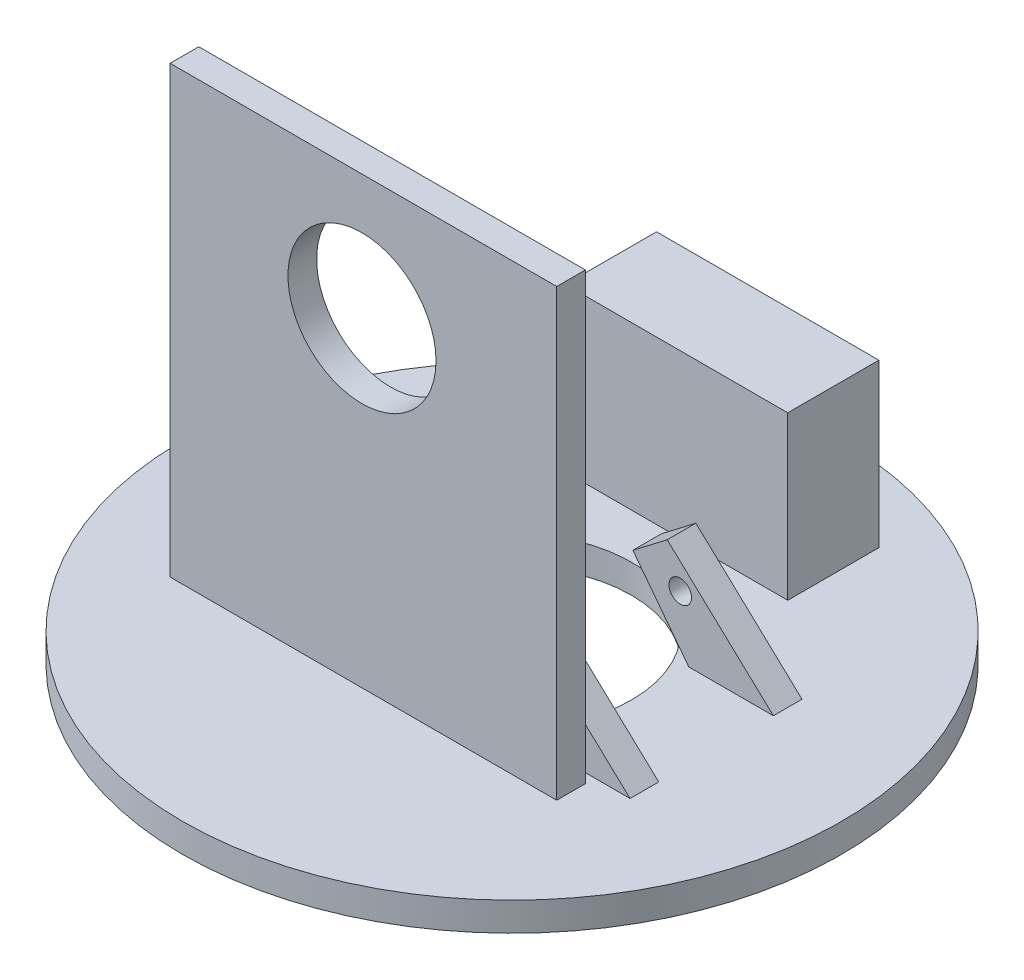
ISO-10303-21;
HEADER;
FILE_DESCRIPTION(('STEP AP214'),'2;1');
FILE_NAME('part.step','',(''),(''),'','','');
FILE_SCHEMA(('AUTOMOTIVE_DESIGN { 1 0 10303 214 1 1 1 1 }'));
ENDSEC;
DATA;
#1=APPLICATION_CONTEXT('core data for automotive mechanical design processes');
#2=APPLICATION_PROTOCOL_DEFINITION('international standard','automotive_design',2000,#1);
#3=PRODUCT_CONTEXT('',#1,'mechanical');
#4=PRODUCT('Part','Part','',(#3));
#5=PRODUCT_RELATED_PRODUCT_CATEGORY('part','',(#4));
#6=PRODUCT_DEFINITION_FORMATION('','',#4);
#7=PRODUCT_DEFINITION_CONTEXT('part definition',#1,'design');
#8=PRODUCT_DEFINITION('design','',#6,#7);
#9=PRODUCT_DEFINITION_SHAPE('','',#8);
#10=(LENGTH_UNIT() NAMED_UNIT(*) SI_UNIT(.MILLI.,.METRE.));
#11=(NAMED_UNIT(*) PLANE_ANGLE_UNIT() SI_UNIT($,.RADIAN.));
#12=(NAMED_UNIT(*) SI_UNIT($,.STERADIAN.) SOLID_ANGLE_UNIT());
#13=UNCERTAINTY_MEASURE_WITH_UNIT(LENGTH_MEASURE(1.E-05),#10,'distance_accuracy_value','');
#14=(GEOMETRIC_REPRESENTATION_CONTEXT(3) GLOBAL_UNCERTAINTY_ASSIGNED_CONTEXT((#13)) GLOBAL_UNIT_ASSIGNED_CONTEXT((#10,
#11,#12)) REPRESENTATION_CONTEXT('',''));
#15=CARTESIAN_POINT('',(0.,0.,0.));
#16=DIRECTION('',(0.,0.,1.));
#17=DIRECTION('',(1.,0.,0.));
#18=AXIS2_PLACEMENT_3D('',#15,#16,#17);
#19=CARTESIAN_POINT('',(0.,3.,0.));
#20=DIRECTION('',(0.,1.,0.));
#21=DIRECTION('',(0.,0.,1.));
#22=AXIS2_PLACEMENT_3D('',#19,#20,#21);
#23=PLANE('',#22);
#24=DIRECTION('',(1.,0.,0.));
#25=VECTOR('',#24,1.);
#26=CARTESIAN_POINT('',(17.6713088724537,3.,10.));
#27=LINE('',#26,#25);
#28=CARTESIAN_POINT('',(7.50000000000001,3.,10.));
#29=VERTEX_POINT('',#28);
#30=CARTESIAN_POINT('',(17.6713088724537,3.,10.));
#31=VERTEX_POINT('',#30);
#32=EDGE_CURVE('E236',#29,#31,#27,.T.);
#33=ORIENTED_EDGE('',*,*,#32,.T.);
#34=DIRECTION('',(0.,0.,-1.));
#35=VECTOR('',#34,1.);
#36=CARTESIAN_POINT('',(17.6713088724537,3.,13.));
#37=LINE('',#36,#35);
#38=CARTESIAN_POINT('',(17.6713088724537,3.,13.));
#39=VERTEX_POINT('',#38);
#40=EDGE_CURVE('E265',#39,#31,#37,.T.);
#41=ORIENTED_EDGE('',*,*,#40,.F.);
#42=DIRECTION('',(1.,0.,0.));
#43=VECTOR('',#42,1.);
#44=CARTESIAN_POINT('',(17.6713088724537,3.,13.));
#45=LINE('',#44,#43);
#46=CARTESIAN_POINT('',(-22.7951586180396,3.,13.));
#47=VERTEX_POINT('',#46);
#48=EDGE_CURVE('E238',#47,#39,#45,.T.);
#49=ORIENTED_EDGE('',*,*,#48,.F.);
#50=DIRECTION('',(0.,0.,-1.));
#51=VECTOR('',#50,1.);
#52=CARTESIAN_POINT('',(-22.7951586180396,3.,13.));
#53=LINE('',#52,#51);
#54=CARTESIAN_POINT('',(-22.7951586180396,3.,10.));
#55=VERTEX_POINT('',#54);
#56=EDGE_CURVE('E248',#47,#55,#53,.T.);
#57=ORIENTED_EDGE('',*,*,#56,.T.);
#58=CARTESIAN_POINT('',(-7.5,3.,10.));
#59=VERTEX_POINT('',#58);
#60=EDGE_CURVE('E249',#55,#59,#27,.T.);
#61=ORIENTED_EDGE('',*,*,#60,.T.);
#62=CARTESIAN_POINT('',(0.,3.,0.));
#63=DIRECTION('',(0.,1.,0.));
#64=DIRECTION('',(0.,0.,1.));
#65=AXIS2_PLACEMENT_3D('',#62,#63,#64);
#66=CIRCLE('',#65,12.5);
#67=EDGE_CURVE('E422',#29,#59,#66,.T.);
#68=ORIENTED_EDGE('',*,*,#67,.F.);
#69=EDGE_LOOP('',(#33,#41,#49,#57,#61,#68));
#70=FACE_BOUND('',#69,.T.);
#71=DIRECTION('',(-1.,0.,0.));
#72=VECTOR('',#71,1.);
#73=CARTESIAN_POINT('',(21.352795206109,3.,9.));
#74=LINE('',#73,#72);
#75=CARTESIAN_POINT('',(21.352795206109,3.,9.));
#76=VERTEX_POINT('',#75);
#77=CARTESIAN_POINT('',(12.5,3.,9.));
#78=VERTEX_POINT('',#77);
#79=EDGE_CURVE('E312',#76,#78,#74,.T.);
#80=ORIENTED_EDGE('',*,*,#79,.T.);
#81=DIRECTION('',(0.,0.,-1.));
#82=VECTOR('',#81,1.);
#83=CARTESIAN_POINT('',(12.5,3.,9.));
#84=LINE('',#83,#82);
#85=CARTESIAN_POINT('',(12.5,3.,6.));
#86=VERTEX_POINT('',#85);
#87=EDGE_CURVE('E325',#78,#86,#84,.T.);
#88=ORIENTED_EDGE('',*,*,#87,.T.);
#89=DIRECTION('',(-1.,0.,0.));
#90=VECTOR('',#89,1.);
#91=CARTESIAN_POINT('',(21.352795206109,3.,6.));
#92=LINE('',#91,#90);
#93=CARTESIAN_POINT('',(21.352795206109,3.,6.));
#94=VERTEX_POINT('',#93);
#95=EDGE_CURVE('E309',#94,#86,#92,.T.);
#96=ORIENTED_EDGE('',*,*,#95,.F.);
#97=DIRECTION('',(0.,0.,-1.));
#98=VECTOR('',#97,1.);
#99=CARTESIAN_POINT('',(21.352795206109,3.,9.));
#100=LINE('',#99,#98);
#101=EDGE_CURVE('E340',#76,#94,#100,.T.);
#102=ORIENTED_EDGE('',*,*,#101,.F.);
#103=EDGE_LOOP('',(#80,#88,#96,#102));
#104=FACE_BOUND('',#103,.T.);
#105=CARTESIAN_POINT('',(0.,3.,0.));
#106=DIRECTION('',(0.,1.,0.));
#107=DIRECTION('',(0.,0.,1.));
#108=AXIS2_PLACEMENT_3D('',#105,#106,#107);
#109=CIRCLE('',#108,34.5);
#110=CARTESIAN_POINT('',(0.,3.,34.5));
#111=VERTEX_POINT('',#110);
#112=EDGE_CURVE('E11',#111,#111,#109,.T.);
#113=ORIENTED_EDGE('',*,*,#112,.T.);
#114=EDGE_LOOP('',(#113));
#115=FACE_BOUND('',#114,.T.);
#116=DIRECTION('',(1.,0.,0.));
#117=VECTOR('',#116,1.);
#118=CARTESIAN_POINT('',(-21.352795206109,3.,6.));
#119=LINE('',#118,#117);
#120=CARTESIAN_POINT('',(-21.352795206109,3.,6.));
#121=VERTEX_POINT('',#120);
#122=CARTESIAN_POINT('',(-12.5,3.,6.));
#123=VERTEX_POINT('',#122);
#124=EDGE_CURVE('E385',#121,#123,#119,.T.);
#125=ORIENTED_EDGE('',*,*,#124,.T.);
#126=DIRECTION('',(0.,0.,-1.));
#127=VECTOR('',#126,1.);
#128=CARTESIAN_POINT('',(-12.5,3.,9.));
#129=LINE('',#128,#127);
#130=CARTESIAN_POINT('',(-12.5,3.,9.));
#131=VERTEX_POINT('',#130);
#132=EDGE_CURVE('E415',#131,#123,#129,.T.);
#133=ORIENTED_EDGE('',*,*,#132,.F.);
#134=DIRECTION('',(1.,0.,0.));
#135=VECTOR('',#134,1.);
#136=CARTESIAN_POINT('',(-21.352795206109,3.,9.));
#137=LINE('',#136,#135);
#138=CARTESIAN_POINT('',(-21.352795206109,3.,9.));
#139=VERTEX_POINT('',#138);
#140=EDGE_CURVE('E388',#139,#131,#137,.T.);
#141=ORIENTED_EDGE('',*,*,#140,.F.);
#142=DIRECTION('',(0.,0.,-1.));
#143=VECTOR('',#142,1.);
#144=CARTESIAN_POINT('',(-21.352795206109,3.,9.));
#145=LINE('',#144,#143);
#146=EDGE_CURVE('E398',#139,#121,#145,.T.);
#147=ORIENTED_EDGE('',*,*,#146,.T.);
#148=EDGE_LOOP('',(#125,#133,#141,#147));
#149=FACE_BOUND('',#148,.T.);
#150=DIRECTION('',(0.,0.,1.));
#151=VECTOR('',#150,1.);
#152=CARTESIAN_POINT('',(-21.352795206109,3.,-9.));
#153=LINE('',#152,#151);
#154=CARTESIAN_POINT('',(-21.352795206109,3.,-9.));
#155=VERTEX_POINT('',#154);
#156=CARTESIAN_POINT('',(-21.352795206109,3.,-6.));
#157=VERTEX_POINT('',#156);
#158=EDGE_CURVE('E373',#155,#157,#153,.T.);
#159=ORIENTED_EDGE('',*,*,#158,.F.);
#160=DIRECTION('',(1.,0.,0.));
#161=VECTOR('',#160,1.);
#162=CARTESIAN_POINT('',(-21.352795206109,3.,-9.));
#163=LINE('',#162,#161);
#164=CARTESIAN_POINT('',(-12.5,3.,-9.));
#165=VERTEX_POINT('',#164);
#166=EDGE_CURVE('E350',#155,#165,#163,.T.);
#167=ORIENTED_EDGE('',*,*,#166,.T.);
#168=DIRECTION('',(0.,0.,1.));
#169=VECTOR('',#168,1.);
#170=CARTESIAN_POINT('',(-12.5,3.,-9.));
#171=LINE('',#170,#169);
#172=CARTESIAN_POINT('',(-12.5,3.,-6.));
#173=VERTEX_POINT('',#172);
#174=EDGE_CURVE('E362',#165,#173,#171,.T.);
#175=ORIENTED_EDGE('',*,*,#174,.T.);
#176=DIRECTION('',(1.,0.,0.));
#177=VECTOR('',#176,1.);
#178=CARTESIAN_POINT('',(-21.352795206109,3.,-6.));
#179=LINE('',#178,#177);
#180=EDGE_CURVE('E347',#157,#173,#179,.T.);
#181=ORIENTED_EDGE('',*,*,#180,.F.);
#182=EDGE_LOOP('',(#159,#167,#175,#181));
#183=FACE_BOUND('',#182,.T.);
#184=DIRECTION('',(-1.,0.,0.));
#185=VECTOR('',#184,1.);
#186=CARTESIAN_POINT('',(21.352795206109,3.,-6.));
#187=LINE('',#186,#185);
#188=CARTESIAN_POINT('',(21.352795206109,3.,-6.));
#189=VERTEX_POINT('',#188);
#190=CARTESIAN_POINT('',(12.5,3.,-6.));
#191=VERTEX_POINT('',#190);
#192=EDGE_CURVE('E272',#189,#191,#187,.T.);
#193=ORIENTED_EDGE('',*,*,#192,.T.);
#194=DIRECTION('',(0.,0.,1.));
#195=VECTOR('',#194,1.);
#196=CARTESIAN_POINT('',(12.5,3.,-9.));
#197=LINE('',#196,#195);
#198=CARTESIAN_POINT('',(12.5,3.,-9.));
#199=VERTEX_POINT('',#198);
#200=EDGE_CURVE('E294',#199,#191,#197,.T.);
#201=ORIENTED_EDGE('',*,*,#200,.F.);
#202=DIRECTION('',(-1.,0.,0.));
#203=VECTOR('',#202,1.);
#204=CARTESIAN_POINT('',(21.352795206109,3.,-9.));
#205=LINE('',#204,#203);
#206=CARTESIAN_POINT('',(21.352795206109,3.,-9.));
#207=VERTEX_POINT('',#206);
#208=EDGE_CURVE('E275',#207,#199,#205,.T.);
#209=ORIENTED_EDGE('',*,*,#208,.F.);
#210=DIRECTION('',(0.,0.,1.));
#211=VECTOR('',#210,1.);
#212=CARTESIAN_POINT('',(21.352795206109,3.,-9.));
#213=LINE('',#212,#211);
#214=EDGE_CURVE('E285',#207,#189,#213,.T.);
#215=ORIENTED_EDGE('',*,*,#214,.T.);
#216=EDGE_LOOP('',(#193,#201,#209,#215));
#217=FACE_BOUND('',#216,.T.);
#218=DIRECTION('',(1.,0.,0.));
#219=VECTOR('',#218,1.);
#220=CARTESIAN_POINT('',(-11.6374636010067,3.,-17.2193865491639));
#221=LINE('',#220,#219);
#222=CARTESIAN_POINT('',(-11.6374636010067,3.,-17.2193865491639));
#223=VERTEX_POINT('',#222);
#224=CARTESIAN_POINT('',(11.6374636010067,3.,-17.2193865491639));
#225=VERTEX_POINT('',#224);
#226=EDGE_CURVE('E529',#223,#225,#221,.T.);
#227=ORIENTED_EDGE('',*,*,#226,.F.);
#228=DIRECTION('',(0.,0.,1.));
#229=VECTOR('',#228,1.);
#230=CARTESIAN_POINT('',(-11.6374636010067,3.,-26.7594003151055));
#231=LINE('',#230,#229);
#232=CARTESIAN_POINT('',(-11.6374636010067,3.,-26.7594003151055));
#233=VERTEX_POINT('',#232);
#234=EDGE_CURVE('E225',#233,#223,#231,.T.);
#235=ORIENTED_EDGE('',*,*,#234,.F.);
#236=DIRECTION('',(-1.,0.,0.));
#237=VECTOR('',#236,1.);
#238=CARTESIAN_POINT('',(-11.6374636010067,3.,-26.7594003151055));
#239=LINE('',#238,#237);
#240=CARTESIAN_POINT('',(11.6374636010067,3.,-26.7594003151055));
#241=VERTEX_POINT('',#240);
#242=EDGE_CURVE('E221',#241,#233,#239,.T.);
#243=ORIENTED_EDGE('',*,*,#242,.F.);
#244=DIRECTION('',(0.,0.,-1.));
#245=VECTOR('',#244,1.);
#246=CARTESIAN_POINT('',(11.6374636010067,3.,-26.7594003151055));
#247=LINE('',#246,#245);
#248=EDGE_CURVE('E531',#225,#241,#247,.T.);
#249=ORIENTED_EDGE('',*,*,#248,.F.);
#250=EDGE_LOOP('',(#227,#235,#243,#249));
#251=FACE_BOUND('',#250,.T.);
#252=ADVANCED_FACE('F35',(#70,#104,#115,#149,#183,#217,#251),#23,.T.);
#253=CARTESIAN_POINT('',(0.,3.,0.));
#254=DIRECTION('',(0.,-1.,0.));
#255=DIRECTION('',(0.,0.,-1.));
#256=AXIS2_PLACEMENT_3D('',#253,#254,#255);
#257=CYLINDRICAL_SURFACE('',#256,34.5);
#258=ORIENTED_EDGE('',*,*,#112,.F.);
#259=EDGE_LOOP('',(#258));
#260=FACE_BOUND('',#259,.T.);
#261=CARTESIAN_POINT('',(0.,0.,0.));
#262=DIRECTION('',(0.,1.,0.));
#263=DIRECTION('',(0.,0.,1.));
#264=AXIS2_PLACEMENT_3D('',#261,#262,#263);
#265=CIRCLE('',#264,34.5);
#266=CARTESIAN_POINT('',(0.,0.,34.5));
#267=VERTEX_POINT('',#266);
#268=EDGE_CURVE('E39',#267,#267,#265,.T.);
#269=ORIENTED_EDGE('',*,*,#268,.T.);
#270=EDGE_LOOP('',(#269));
#271=FACE_BOUND('',#270,.T.);
#272=ADVANCED_FACE('F37',(#260,#271),#257,.T.);
#273=CARTESIAN_POINT('',(0.,0.,0.));
#274=DIRECTION('',(0.,1.,0.));
#275=DIRECTION('',(0.,0.,1.));
#276=AXIS2_PLACEMENT_3D('',#273,#274,#275);
#277=PLANE('',#276);
#278=CARTESIAN_POINT('',(0.,0.,0.));
#279=DIRECTION('',(0.,1.,0.));
#280=DIRECTION('',(0.,0.,1.));
#281=AXIS2_PLACEMENT_3D('',#278,#279,#280);
#282=CIRCLE('',#281,12.5);
#283=CARTESIAN_POINT('',(0.,0.,12.5));
#284=VERTEX_POINT('',#283);
#285=EDGE_CURVE('E419',#284,#284,#282,.T.);
#286=ORIENTED_EDGE('',*,*,#285,.T.);
#287=EDGE_LOOP('',(#286));
#288=FACE_BOUND('',#287,.T.);
#289=ORIENTED_EDGE('',*,*,#268,.F.);
#290=EDGE_LOOP('',(#289));
#291=FACE_BOUND('',#290,.T.);
#292=ADVANCED_FACE('F467',(#288,#291),#277,.F.);
#293=CARTESIAN_POINT('',(0.,0.,0.));
#294=DIRECTION('',(0.,1.,0.));
#295=DIRECTION('',(0.,0.,1.));
#296=AXIS2_PLACEMENT_3D('',#293,#294,#295);
#297=CYLINDRICAL_SURFACE('',#296,12.5);
#298=ORIENTED_EDGE('',*,*,#285,.F.);
#299=EDGE_LOOP('',(#298));
#300=FACE_BOUND('',#299,.T.);
#301=ORIENTED_EDGE('',*,*,#67,.T.);
#302=EDGE_CURVE('E418',#59,#29,#66,.T.);
#303=ORIENTED_EDGE('',*,*,#302,.T.);
#304=EDGE_LOOP('',(#301,#303));
#305=FACE_BOUND('',#304,.T.);
#306=ADVANCED_FACE('F427',(#300,#305),#297,.F.);
#307=CARTESIAN_POINT('',(0.,0.,9.));
#308=DIRECTION('',(0.,0.,1.));
#309=DIRECTION('',(1.,0.,0.));
#310=AXIS2_PLACEMENT_3D('',#307,#308,#309);
#311=PLANE('',#310);
#312=ORIENTED_EDGE('',*,*,#140,.T.);
#313=DIRECTION('',(0.607760810689808,0.794120140148622,0.));
#314=VECTOR('',#313,1.);
#315=CARTESIAN_POINT('',(-12.5,3.,9.));
#316=LINE('',#315,#314);
#317=CARTESIAN_POINT('',(-6.64576131490967,10.6493396140347,9.));
#318=VERTEX_POINT('',#317);
#319=EDGE_CURVE('E391',#131,#318,#316,.T.);
#320=ORIENTED_EDGE('',*,*,#319,.T.);
#321=DIRECTION('',(-0.794120140148622,0.607760810689809,0.));
#322=VECTOR('',#321,1.);
#323=CARTESIAN_POINT('',(-6.64576131490967,10.6493396140347,9.));
#324=LINE('',#323,#322);
#325=CARTESIAN_POINT('',(-10.2402909014888,13.4003266563467,9.));
#326=VERTEX_POINT('',#325);
#327=EDGE_CURVE('E394',#318,#326,#324,.T.);
#328=ORIENTED_EDGE('',*,*,#327,.T.);
#329=DIRECTION('',(-0.730115432317459,-0.683323829155614,0.));
#330=VECTOR('',#329,1.);
#331=CARTESIAN_POINT('',(-10.2402909014888,13.4003266563467,9.));
#332=LINE('',#331,#330);
#333=EDGE_CURVE('E396',#326,#139,#332,.T.);
#334=ORIENTED_EDGE('',*,*,#333,.T.);
#335=EDGE_LOOP('',(#312,#320,#328,#334));
#336=FACE_BOUND('',#335,.T.);
#337=CARTESIAN_POINT('',(-11.6067092045982,9.42079479502982,9.));
#338=DIRECTION('',(0.,0.,1.));
#339=DIRECTION('',(1.,0.,0.));
#340=AXIS2_PLACEMENT_3D('',#337,#338,#339);
#341=CIRCLE('',#340,1.18301733849826);
#342=CARTESIAN_POINT('',(-10.4236918660999,9.42079479502982,9.));
#343=VERTEX_POINT('',#342);
#344=EDGE_CURVE('E382',#343,#343,#341,.T.);
#345=ORIENTED_EDGE('',*,*,#344,.F.);
#346=EDGE_LOOP('',(#345));
#347=FACE_BOUND('',#346,.T.);
#348=ADVANCED_FACE('F478',(#336,#347),#311,.T.);
#349=CARTESIAN_POINT('',(0.,0.,6.));
#350=DIRECTION('',(0.,0.,1.));
#351=DIRECTION('',(1.,0.,0.));
#352=AXIS2_PLACEMENT_3D('',#349,#350,#351);
#353=PLANE('',#352);
#354=ORIENTED_EDGE('',*,*,#124,.F.);
#355=DIRECTION('',(-0.730115432317459,-0.683323829155614,0.));
#356=VECTOR('',#355,1.);
#357=CARTESIAN_POINT('',(-10.2402909014888,13.4003266563467,6.));
#358=LINE('',#357,#356);
#359=CARTESIAN_POINT('',(-10.2402909014888,13.4003266563467,6.));
#360=VERTEX_POINT('',#359);
#361=EDGE_CURVE('E392',#360,#121,#358,.T.);
#362=ORIENTED_EDGE('',*,*,#361,.F.);
#363=DIRECTION('',(-0.794120140148622,0.607760810689809,0.));
#364=VECTOR('',#363,1.);
#365=CARTESIAN_POINT('',(-6.64576131490967,10.6493396140347,6.));
#366=LINE('',#365,#364);
#367=CARTESIAN_POINT('',(-6.64576131490967,10.6493396140347,6.));
#368=VERTEX_POINT('',#367);
#369=EDGE_CURVE('E403',#368,#360,#366,.T.);
#370=ORIENTED_EDGE('',*,*,#369,.F.);
#371=DIRECTION('',(0.607760810689808,0.794120140148622,0.));
#372=VECTOR('',#371,1.);
#373=CARTESIAN_POINT('',(-12.5,3.,6.));
#374=LINE('',#373,#372);
#375=EDGE_CURVE('E401',#123,#368,#374,.T.);
#376=ORIENTED_EDGE('',*,*,#375,.F.);
#377=EDGE_LOOP('',(#354,#362,#370,#376));
#378=FACE_BOUND('',#377,.T.);
#379=CARTESIAN_POINT('',(-11.6067092045982,9.42079479502982,6.));
#380=DIRECTION('',(0.,0.,1.));
#381=DIRECTION('',(1.,0.,0.));
#382=AXIS2_PLACEMENT_3D('',#379,#380,#381);
#383=CIRCLE('',#382,1.18301733849826);
#384=CARTESIAN_POINT('',(-10.4236918660999,9.42079479502982,6.));
#385=VERTEX_POINT('',#384);
#386=EDGE_CURVE('E376',#385,#385,#383,.T.);
#387=ORIENTED_EDGE('',*,*,#386,.T.);
#388=EDGE_LOOP('',(#387));
#389=FACE_BOUND('',#388,.T.);
#390=ADVANCED_FACE('F488',(#378,#389),#353,.F.);
#391=CARTESIAN_POINT('',(-12.5,3.,9.));
#392=DIRECTION('',(-0.794120140148622,0.607760810689809,0.));
#393=DIRECTION('',(-0.607760810689809,-0.794120140148622,0.));
#394=AXIS2_PLACEMENT_3D('',#391,#392,#393);
#395=PLANE('',#394);
#396=ORIENTED_EDGE('',*,*,#375,.T.);
#397=DIRECTION('',(0.,0.,-1.));
#398=VECTOR('',#397,1.);
#399=CARTESIAN_POINT('',(-6.64576131490967,10.6493396140347,9.));
#400=LINE('',#399,#398);
#401=EDGE_CURVE('E412',#318,#368,#400,.T.);
#402=ORIENTED_EDGE('',*,*,#401,.F.);
#403=ORIENTED_EDGE('',*,*,#319,.F.);
#404=ORIENTED_EDGE('',*,*,#132,.T.);
#405=EDGE_LOOP('',(#396,#402,#403,#404));
#406=FACE_BOUND('',#405,.T.);
#407=ADVANCED_FACE('F493',(#406),#395,.F.);
#408=CARTESIAN_POINT('',(-6.64576131490967,10.6493396140347,9.));
#409=DIRECTION('',(-0.607760810689808,-0.794120140148622,0.));
#410=DIRECTION('',(0.794120140148622,-0.607760810689809,0.));
#411=AXIS2_PLACEMENT_3D('',#408,#409,#410);
#412=PLANE('',#411);
#413=ORIENTED_EDGE('',*,*,#369,.T.);
#414=DIRECTION('',(0.,0.,-1.));
#415=VECTOR('',#414,1.);
#416=CARTESIAN_POINT('',(-10.2402909014888,13.4003266563467,9.));
#417=LINE('',#416,#415);
#418=EDGE_CURVE('E409',#326,#360,#417,.T.);
#419=ORIENTED_EDGE('',*,*,#418,.F.);
#420=ORIENTED_EDGE('',*,*,#327,.F.);
#421=ORIENTED_EDGE('',*,*,#401,.T.);
#422=EDGE_LOOP('',(#413,#419,#420,#421));
#423=FACE_BOUND('',#422,.T.);
#424=ADVANCED_FACE('F504',(#423),#412,.F.);
#425=CARTESIAN_POINT('',(-10.2402909014888,13.4003266563467,9.));
#426=DIRECTION('',(0.683323829155614,-0.730115432317459,0.));
#427=DIRECTION('',(0.730115432317459,0.683323829155614,0.));
#428=AXIS2_PLACEMENT_3D('',#425,#426,#427);
#429=PLANE('',#428);
#430=ORIENTED_EDGE('',*,*,#361,.T.);
#431=ORIENTED_EDGE('',*,*,#146,.F.);
#432=ORIENTED_EDGE('',*,*,#333,.F.);
#433=ORIENTED_EDGE('',*,*,#418,.T.);
#434=EDGE_LOOP('',(#430,#431,#432,#433));
#435=FACE_BOUND('',#434,.T.);
#436=ADVANCED_FACE('F501',(#435),#429,.F.);
#437=CARTESIAN_POINT('',(-11.6067092045982,9.42079479502982,9.));
#438=DIRECTION('',(0.,0.,-1.));
#439=DIRECTION('',(-1.,0.,0.));
#440=AXIS2_PLACEMENT_3D('',#437,#438,#439);
#441=CYLINDRICAL_SURFACE('',#440,1.18301733849826);
#442=ORIENTED_EDGE('',*,*,#344,.T.);
#443=EDGE_LOOP('',(#442));
#444=FACE_BOUND('',#443,.T.);
#445=ORIENTED_EDGE('',*,*,#386,.F.);
#446=EDGE_LOOP('',(#445));
#447=FACE_BOUND('',#446,.T.);
#448=ADVANCED_FACE('F498',(#444,#447),#441,.F.);
#449=CARTESIAN_POINT('',(-10.2402909014888,13.4003266563467,-9.));
#450=DIRECTION('',(-0.683323829155614,0.730115432317459,0.));
#451=DIRECTION('',(-0.730115432317459,-0.683323829155614,0.));
#452=AXIS2_PLACEMENT_3D('',#449,#450,#451);
#453=PLANE('',#452);
#454=DIRECTION('',(-0.730115432317459,-0.683323829155614,0.));
#455=VECTOR('',#454,1.);
#456=CARTESIAN_POINT('',(-10.2402909014888,13.4003266563467,-6.));
#457=LINE('',#456,#455);
#458=CARTESIAN_POINT('',(-10.2402909014888,13.4003266563467,-6.));
#459=VERTEX_POINT('',#458);
#460=EDGE_CURVE('E353',#459,#157,#457,.T.);
#461=ORIENTED_EDGE('',*,*,#460,.F.);
#462=DIRECTION('',(0.,0.,1.));
#463=VECTOR('',#462,1.);
#464=CARTESIAN_POINT('',(-10.2402909014888,13.4003266563467,-9.));
#465=LINE('',#464,#463);
#466=CARTESIAN_POINT('',(-10.2402909014888,13.4003266563467,-9.));
#467=VERTEX_POINT('',#466);
#468=EDGE_CURVE('E377',#467,#459,#465,.T.);
#469=ORIENTED_EDGE('',*,*,#468,.F.);
#470=DIRECTION('',(-0.730115432317459,-0.683323829155614,0.));
#471=VECTOR('',#470,1.);
#472=CARTESIAN_POINT('',(-10.2402909014888,13.4003266563467,-9.));
#473=LINE('',#472,#471);
#474=EDGE_CURVE('E359',#467,#155,#473,.T.);
#475=ORIENTED_EDGE('',*,*,#474,.T.);
#476=ORIENTED_EDGE('',*,*,#158,.T.);
#477=EDGE_LOOP('',(#461,#469,#475,#476));
#478=FACE_BOUND('',#477,.T.);
#479=ADVANCED_FACE('F787',(#478),#453,.T.);
#480=CARTESIAN_POINT('',(-6.64576131490967,10.6493396140347,-9.));
#481=DIRECTION('',(0.607760810689808,0.794120140148622,0.));
#482=DIRECTION('',(-0.794120140148622,0.607760810689809,0.));
#483=AXIS2_PLACEMENT_3D('',#480,#481,#482);
#484=PLANE('',#483);
#485=DIRECTION('',(-0.794120140148622,0.607760810689809,0.));
#486=VECTOR('',#485,1.);
#487=CARTESIAN_POINT('',(-6.64576131490967,10.6493396140347,-6.));
#488=LINE('',#487,#486);
#489=CARTESIAN_POINT('',(-6.64576131490967,10.6493396140347,-6.));
#490=VERTEX_POINT('',#489);
#491=EDGE_CURVE('E368',#490,#459,#488,.T.);
#492=ORIENTED_EDGE('',*,*,#491,.F.);
#493=DIRECTION('',(0.,0.,1.));
#494=VECTOR('',#493,1.);
#495=CARTESIAN_POINT('',(-6.64576131490967,10.6493396140347,-9.));
#496=LINE('',#495,#494);
#497=CARTESIAN_POINT('',(-6.64576131490967,10.6493396140347,-9.));
#498=VERTEX_POINT('',#497);
#499=EDGE_CURVE('E379',#498,#490,#496,.T.);
#500=ORIENTED_EDGE('',*,*,#499,.F.);
#501=DIRECTION('',(-0.794120140148622,0.607760810689809,0.));
#502=VECTOR('',#501,1.);
#503=CARTESIAN_POINT('',(-6.64576131490967,10.6493396140347,-9.));
#504=LINE('',#503,#502);
#505=EDGE_CURVE('E356',#498,#467,#504,.T.);
#506=ORIENTED_EDGE('',*,*,#505,.T.);
#507=ORIENTED_EDGE('',*,*,#468,.T.);
#508=EDGE_LOOP('',(#492,#500,#506,#507));
#509=FACE_BOUND('',#508,.T.);
#510=ADVANCED_FACE('F779',(#509),#484,.T.);
#511=CARTESIAN_POINT('',(-12.5,3.,-9.));
#512=DIRECTION('',(0.794120140148622,-0.607760810689809,0.));
#513=DIRECTION('',(0.607760810689809,0.794120140148622,0.));
#514=AXIS2_PLACEMENT_3D('',#511,#512,#513);
#515=PLANE('',#514);
#516=DIRECTION('',(0.607760810689808,0.794120140148622,0.));
#517=VECTOR('',#516,1.);
#518=CARTESIAN_POINT('',(-12.5,3.,-6.));
#519=LINE('',#518,#517);
#520=EDGE_CURVE('E365',#173,#490,#519,.T.);
#521=ORIENTED_EDGE('',*,*,#520,.F.);
#522=ORIENTED_EDGE('',*,*,#174,.F.);
#523=DIRECTION('',(0.607760810689808,0.794120140148622,0.));
#524=VECTOR('',#523,1.);
#525=CARTESIAN_POINT('',(-12.5,3.,-9.));
#526=LINE('',#525,#524);
#527=EDGE_CURVE('E352',#165,#498,#526,.T.);
#528=ORIENTED_EDGE('',*,*,#527,.T.);
#529=ORIENTED_EDGE('',*,*,#499,.T.);
#530=EDGE_LOOP('',(#521,#522,#528,#529));
#531=FACE_BOUND('',#530,.T.);
#532=ADVANCED_FACE('F770',(#531),#515,.T.);
#533=CARTESIAN_POINT('',(0.,0.,-9.));
#534=DIRECTION('',(0.,0.,1.));
#535=DIRECTION('',(1.,0.,0.));
#536=AXIS2_PLACEMENT_3D('',#533,#534,#535);
#537=PLANE('',#536);
#538=CARTESIAN_POINT('',(-11.6067092045982,9.42079479502982,-9.));
#539=DIRECTION('',(0.,0.,1.));
#540=DIRECTION('',(1.,0.,0.));
#541=AXIS2_PLACEMENT_3D('',#538,#539,#540);
#542=CIRCLE('',#541,1.18301733849826);
#543=CARTESIAN_POINT('',(-10.4236918660999,9.42079479502982,-9.));
#544=VERTEX_POINT('',#543);
#545=EDGE_CURVE('E344',#544,#544,#542,.T.);
#546=ORIENTED_EDGE('',*,*,#545,.T.);
#547=EDGE_LOOP('',(#546));
#548=FACE_BOUND('',#547,.T.);
#549=ORIENTED_EDGE('',*,*,#166,.F.);
#550=ORIENTED_EDGE('',*,*,#474,.F.);
#551=ORIENTED_EDGE('',*,*,#505,.F.);
#552=ORIENTED_EDGE('',*,*,#527,.F.);
#553=EDGE_LOOP('',(#549,#550,#551,#552));
#554=FACE_BOUND('',#553,.T.);
#555=ADVANCED_FACE('F761',(#548,#554),#537,.F.);
#556=CARTESIAN_POINT('',(0.,0.,-6.));
#557=DIRECTION('',(0.,0.,1.));
#558=DIRECTION('',(1.,0.,0.));
#559=AXIS2_PLACEMENT_3D('',#556,#557,#558);
#560=PLANE('',#559);
#561=CARTESIAN_POINT('',(-11.6067092045982,9.42079479502982,-6.));
#562=DIRECTION('',(0.,0.,1.));
#563=DIRECTION('',(1.,0.,0.));
#564=AXIS2_PLACEMENT_3D('',#561,#562,#563);
#565=CIRCLE('',#564,1.18301733849826);
#566=CARTESIAN_POINT('',(-10.4236918660999,9.42079479502982,-6.));
#567=VERTEX_POINT('',#566);
#568=EDGE_CURVE('E343',#567,#567,#565,.T.);
#569=ORIENTED_EDGE('',*,*,#568,.F.);
#570=EDGE_LOOP('',(#569));
#571=FACE_BOUND('',#570,.T.);
#572=ORIENTED_EDGE('',*,*,#180,.T.);
#573=ORIENTED_EDGE('',*,*,#520,.T.);
#574=ORIENTED_EDGE('',*,*,#491,.T.);
#575=ORIENTED_EDGE('',*,*,#460,.T.);
#576=EDGE_LOOP('',(#572,#573,#574,#575));
#577=FACE_BOUND('',#576,.T.);
#578=ADVANCED_FACE('F752',(#571,#577),#560,.T.);
#579=CARTESIAN_POINT('',(-11.6067092045982,9.42079479502982,-9.));
#580=DIRECTION('',(0.,0.,1.));
#581=DIRECTION('',(1.,0.,0.));
#582=AXIS2_PLACEMENT_3D('',#579,#580,#581);
#583=CYLINDRICAL_SURFACE('',#582,1.18301733849826);
#584=ORIENTED_EDGE('',*,*,#545,.F.);
#585=EDGE_LOOP('',(#584));
#586=FACE_BOUND('',#585,.T.);
#587=ORIENTED_EDGE('',*,*,#568,.T.);
#588=EDGE_LOOP('',(#587));
#589=FACE_BOUND('',#588,.T.);
#590=ADVANCED_FACE('F743',(#586,#589),#583,.F.);
#591=CARTESIAN_POINT('',(10.2402909014888,13.4003266563467,9.));
#592=DIRECTION('',(0.683323829155614,0.730115432317459,0.));
#593=DIRECTION('',(-0.730115432317459,0.683323829155614,0.));
#594=AXIS2_PLACEMENT_3D('',#591,#592,#593);
#595=PLANE('',#594);
#596=DIRECTION('',(0.730115432317459,-0.683323829155614,0.));
#597=VECTOR('',#596,1.);
#598=CARTESIAN_POINT('',(10.2402909014888,13.4003266563467,6.));
#599=LINE('',#598,#597);
#600=CARTESIAN_POINT('',(10.2402909014888,13.4003266563467,6.));
#601=VERTEX_POINT('',#600);
#602=EDGE_CURVE('E327',#601,#94,#599,.T.);
#603=ORIENTED_EDGE('',*,*,#602,.F.);
#604=DIRECTION('',(0.,0.,-1.));
#605=VECTOR('',#604,1.);
#606=CARTESIAN_POINT('',(10.2402909014888,13.4003266563467,9.));
#607=LINE('',#606,#605);
#608=CARTESIAN_POINT('',(10.2402909014888,13.4003266563467,9.));
#609=VERTEX_POINT('',#608);
#610=EDGE_CURVE('E338',#609,#601,#607,.T.);
#611=ORIENTED_EDGE('',*,*,#610,.F.);
#612=DIRECTION('',(0.730115432317459,-0.683323829155614,0.));
#613=VECTOR('',#612,1.);
#614=CARTESIAN_POINT('',(10.2402909014888,13.4003266563467,9.));
#615=LINE('',#614,#613);
#616=EDGE_CURVE('E315',#609,#76,#615,.T.);
#617=ORIENTED_EDGE('',*,*,#616,.T.);
#618=ORIENTED_EDGE('',*,*,#101,.T.);
#619=EDGE_LOOP('',(#603,#611,#617,#618));
#620=FACE_BOUND('',#619,.T.);
#621=ADVANCED_FACE('F734',(#620),#595,.T.);
#622=CARTESIAN_POINT('',(6.64576131490967,10.6493396140347,9.));
#623=DIRECTION('',(-0.607760810689808,0.794120140148622,0.));
#624=DIRECTION('',(-0.794120140148622,-0.607760810689809,0.));
#625=AXIS2_PLACEMENT_3D('',#622,#623,#624);
#626=PLANE('',#625);
#627=DIRECTION('',(0.794120140148622,0.607760810689809,0.));
#628=VECTOR('',#627,1.);
#629=CARTESIAN_POINT('',(6.64576131490967,10.6493396140347,6.));
#630=LINE('',#629,#628);
#631=CARTESIAN_POINT('',(6.64576131490967,10.6493396140347,6.));
#632=VERTEX_POINT('',#631);
#633=EDGE_CURVE('E329',#632,#601,#630,.T.);
#634=ORIENTED_EDGE('',*,*,#633,.F.);
#635=DIRECTION('',(0.,0.,-1.));
#636=VECTOR('',#635,1.);
#637=CARTESIAN_POINT('',(6.64576131490967,10.6493396140347,9.));
#638=LINE('',#637,#636);
#639=CARTESIAN_POINT('',(6.64576131490967,10.6493396140347,9.));
#640=VERTEX_POINT('',#639);
#641=EDGE_CURVE('E336',#640,#632,#638,.T.);
#642=ORIENTED_EDGE('',*,*,#641,.F.);
#643=DIRECTION('',(0.794120140148622,0.607760810689809,0.));
#644=VECTOR('',#643,1.);
#645=CARTESIAN_POINT('',(6.64576131490967,10.6493396140347,9.));
#646=LINE('',#645,#644);
#647=EDGE_CURVE('E319',#640,#609,#646,.T.);
#648=ORIENTED_EDGE('',*,*,#647,.T.);
#649=ORIENTED_EDGE('',*,*,#610,.T.);
#650=EDGE_LOOP('',(#634,#642,#648,#649));
#651=FACE_BOUND('',#650,.T.);
#652=ADVANCED_FACE('F725',(#651),#626,.T.);
#653=CARTESIAN_POINT('',(12.5,3.,9.));
#654=DIRECTION('',(-0.794120140148622,-0.607760810689809,0.));
#655=DIRECTION('',(0.607760810689809,-0.794120140148622,0.));
#656=AXIS2_PLACEMENT_3D('',#653,#654,#655);
#657=PLANE('',#656);
#658=DIRECTION('',(-0.607760810689808,0.794120140148622,0.));
#659=VECTOR('',#658,1.);
#660=CARTESIAN_POINT('',(12.5,3.,6.));
#661=LINE('',#660,#659);
#662=EDGE_CURVE('E316',#86,#632,#661,.T.);
#663=ORIENTED_EDGE('',*,*,#662,.F.);
#664=ORIENTED_EDGE('',*,*,#87,.F.);
#665=DIRECTION('',(-0.607760810689808,0.794120140148622,0.));
#666=VECTOR('',#665,1.);
#667=CARTESIAN_POINT('',(12.5,3.,9.));
#668=LINE('',#667,#666);
#669=EDGE_CURVE('E322',#78,#640,#668,.T.);
#670=ORIENTED_EDGE('',*,*,#669,.T.);
#671=ORIENTED_EDGE('',*,*,#641,.T.);
#672=EDGE_LOOP('',(#663,#664,#670,#671));
#673=FACE_BOUND('',#672,.T.);
#674=ADVANCED_FACE('F716',(#673),#657,.T.);
#675=CARTESIAN_POINT('',(0.,0.,9.));
#676=DIRECTION('',(0.,0.,1.));
#677=DIRECTION('',(-1.,0.,0.));
#678=AXIS2_PLACEMENT_3D('',#675,#676,#677);
#679=PLANE('',#678);
#680=CARTESIAN_POINT('',(11.6067092045982,9.42079479502982,9.));
#681=DIRECTION('',(0.,0.,-1.));
#682=DIRECTION('',(-1.,0.,0.));
#683=AXIS2_PLACEMENT_3D('',#680,#681,#682);
#684=CIRCLE('',#683,1.18301733849826);
#685=CARTESIAN_POINT('',(10.4236918660999,9.42079479502982,9.));
#686=VERTEX_POINT('',#685);
#687=EDGE_CURVE('E306',#686,#686,#684,.T.);
#688=ORIENTED_EDGE('',*,*,#687,.T.);
#689=EDGE_LOOP('',(#688));
#690=FACE_BOUND('',#689,.T.);
#691=ORIENTED_EDGE('',*,*,#79,.F.);
#692=ORIENTED_EDGE('',*,*,#616,.F.);
#693=ORIENTED_EDGE('',*,*,#647,.F.);
#694=ORIENTED_EDGE('',*,*,#669,.F.);
#695=EDGE_LOOP('',(#691,#692,#693,#694));
#696=FACE_BOUND('',#695,.T.);
#697=ADVANCED_FACE('F707',(#690,#696),#679,.T.);
#698=CARTESIAN_POINT('',(0.,0.,6.));
#699=DIRECTION('',(0.,0.,1.));
#700=DIRECTION('',(-1.,0.,0.));
#701=AXIS2_PLACEMENT_3D('',#698,#699,#700);
#702=PLANE('',#701);
#703=CARTESIAN_POINT('',(11.6067092045982,9.42079479502982,6.));
#704=DIRECTION('',(0.,0.,-1.));
#705=DIRECTION('',(-1.,0.,0.));
#706=AXIS2_PLACEMENT_3D('',#703,#704,#705);
#707=CIRCLE('',#706,1.18301733849826);
#708=CARTESIAN_POINT('',(10.4236918660999,9.42079479502982,6.));
#709=VERTEX_POINT('',#708);
#710=EDGE_CURVE('E297',#709,#709,#707,.T.);
#711=ORIENTED_EDGE('',*,*,#710,.F.);
#712=EDGE_LOOP('',(#711));
#713=FACE_BOUND('',#712,.T.);
#714=ORIENTED_EDGE('',*,*,#95,.T.);
#715=ORIENTED_EDGE('',*,*,#662,.T.);
#716=ORIENTED_EDGE('',*,*,#633,.T.);
#717=ORIENTED_EDGE('',*,*,#602,.T.);
#718=EDGE_LOOP('',(#714,#715,#716,#717));
#719=FACE_BOUND('',#718,.T.);
#720=ADVANCED_FACE('F698',(#713,#719),#702,.F.);
#721=CARTESIAN_POINT('',(11.6067092045982,9.42079479502982,9.));
#722=DIRECTION('',(0.,0.,-1.));
#723=DIRECTION('',(-1.,0.,0.));
#724=AXIS2_PLACEMENT_3D('',#721,#722,#723);
#725=CYLINDRICAL_SURFACE('',#724,1.18301733849826);
#726=ORIENTED_EDGE('',*,*,#687,.F.);
#727=EDGE_LOOP('',(#726));
#728=FACE_BOUND('',#727,.T.);
#729=ORIENTED_EDGE('',*,*,#710,.T.);
#730=EDGE_LOOP('',(#729));
#731=FACE_BOUND('',#730,.T.);
#732=ADVANCED_FACE('F689',(#728,#731),#725,.F.);
#733=CARTESIAN_POINT('',(0.,0.,-9.));
#734=DIRECTION('',(0.,0.,1.));
#735=DIRECTION('',(-1.,0.,0.));
#736=AXIS2_PLACEMENT_3D('',#733,#734,#735);
#737=PLANE('',#736);
#738=ORIENTED_EDGE('',*,*,#208,.T.);
#739=DIRECTION('',(-0.607760810689808,0.794120140148622,0.));
#740=VECTOR('',#739,1.);
#741=CARTESIAN_POINT('',(12.5,3.,-9.));
#742=LINE('',#741,#740);
#743=CARTESIAN_POINT('',(6.64576131490967,10.6493396140347,-9.));
#744=VERTEX_POINT('',#743);
#745=EDGE_CURVE('E283',#199,#744,#742,.T.);
#746=ORIENTED_EDGE('',*,*,#745,.T.);
#747=DIRECTION('',(0.794120140148622,0.607760810689809,0.));
#748=VECTOR('',#747,1.);
#749=CARTESIAN_POINT('',(6.64576131490967,10.6493396140347,-9.));
#750=LINE('',#749,#748);
#751=CARTESIAN_POINT('',(10.2402909014888,13.4003266563467,-9.));
#752=VERTEX_POINT('',#751);
#753=EDGE_CURVE('E281',#744,#752,#750,.T.);
#754=ORIENTED_EDGE('',*,*,#753,.T.);
#755=DIRECTION('',(0.730115432317459,-0.683323829155614,0.));
#756=VECTOR('',#755,1.);
#757=CARTESIAN_POINT('',(10.2402909014888,13.4003266563467,-9.));
#758=LINE('',#757,#756);
#759=EDGE_CURVE('E278',#752,#207,#758,.T.);
#760=ORIENTED_EDGE('',*,*,#759,.T.);
#761=EDGE_LOOP('',(#738,#746,#754,#760));
#762=FACE_BOUND('',#761,.T.);
#763=CARTESIAN_POINT('',(11.6067092045982,9.42079479502982,-9.));
#764=DIRECTION('',(0.,0.,-1.));
#765=DIRECTION('',(-1.,0.,0.));
#766=AXIS2_PLACEMENT_3D('',#763,#764,#765);
#767=CIRCLE('',#766,1.18301733849826);
#768=CARTESIAN_POINT('',(10.4236918660999,9.42079479502982,-9.));
#769=VERTEX_POINT('',#768);
#770=EDGE_CURVE('E269',#769,#769,#767,.T.);
#771=ORIENTED_EDGE('',*,*,#770,.F.);
#772=EDGE_LOOP('',(#771));
#773=FACE_BOUND('',#772,.T.);
#774=ADVANCED_FACE('F680',(#762,#773),#737,.F.);
#775=CARTESIAN_POINT('',(0.,0.,-6.));
#776=DIRECTION('',(0.,0.,1.));
#777=DIRECTION('',(-1.,0.,0.));
#778=AXIS2_PLACEMENT_3D('',#775,#776,#777);
#779=PLANE('',#778);
#780=ORIENTED_EDGE('',*,*,#192,.F.);
#781=DIRECTION('',(0.730115432317459,-0.683323829155614,0.));
#782=VECTOR('',#781,1.);
#783=CARTESIAN_POINT('',(10.2402909014888,13.4003266563467,-6.));
#784=LINE('',#783,#782);
#785=CARTESIAN_POINT('',(10.2402909014888,13.4003266563467,-6.));
#786=VERTEX_POINT('',#785);
#787=EDGE_CURVE('E288',#786,#189,#784,.T.);
#788=ORIENTED_EDGE('',*,*,#787,.F.);
#789=DIRECTION('',(0.794120140148622,0.607760810689809,0.));
#790=VECTOR('',#789,1.);
#791=CARTESIAN_POINT('',(6.64576131490967,10.6493396140347,-6.));
#792=LINE('',#791,#790);
#793=CARTESIAN_POINT('',(6.64576131490967,10.6493396140347,-6.));
#794=VERTEX_POINT('',#793);
#795=EDGE_CURVE('E291',#794,#786,#792,.T.);
#796=ORIENTED_EDGE('',*,*,#795,.F.);
#797=DIRECTION('',(-0.607760810689808,0.794120140148622,0.));
#798=VECTOR('',#797,1.);
#799=CARTESIAN_POINT('',(12.5,3.,-6.));
#800=LINE('',#799,#798);
#801=EDGE_CURVE('E279',#191,#794,#800,.T.);
#802=ORIENTED_EDGE('',*,*,#801,.F.);
#803=EDGE_LOOP('',(#780,#788,#796,#802));
#804=FACE_BOUND('',#803,.T.);
#805=CARTESIAN_POINT('',(11.6067092045982,9.42079479502982,-6.));
#806=DIRECTION('',(0.,0.,-1.));
#807=DIRECTION('',(-1.,0.,0.));
#808=AXIS2_PLACEMENT_3D('',#805,#806,#807);
#809=CIRCLE('',#808,1.18301733849826);
#810=CARTESIAN_POINT('',(10.4236918660999,9.42079479502982,-6.));
#811=VERTEX_POINT('',#810);
#812=EDGE_CURVE('E268',#811,#811,#809,.T.);
#813=ORIENTED_EDGE('',*,*,#812,.T.);
#814=EDGE_LOOP('',(#813));
#815=FACE_BOUND('',#814,.T.);
#816=ADVANCED_FACE('F671',(#804,#815),#779,.T.);
#817=CARTESIAN_POINT('',(12.5,3.,-9.));
#818=DIRECTION('',(0.794120140148622,0.607760810689809,0.));
#819=DIRECTION('',(-0.607760810689809,0.794120140148622,0.));
#820=AXIS2_PLACEMENT_3D('',#817,#818,#819);
#821=PLANE('',#820);
#822=ORIENTED_EDGE('',*,*,#801,.T.);
#823=DIRECTION('',(0.,0.,1.));
#824=VECTOR('',#823,1.);
#825=CARTESIAN_POINT('',(6.64576131490967,10.6493396140347,-9.));
#826=LINE('',#825,#824);
#827=EDGE_CURVE('E298',#744,#794,#826,.T.);
#828=ORIENTED_EDGE('',*,*,#827,.F.);
#829=ORIENTED_EDGE('',*,*,#745,.F.);
#830=ORIENTED_EDGE('',*,*,#200,.T.);
#831=EDGE_LOOP('',(#822,#828,#829,#830));
#832=FACE_BOUND('',#831,.T.);
#833=ADVANCED_FACE('F662',(#832),#821,.F.);
#834=CARTESIAN_POINT('',(6.64576131490967,10.6493396140347,-9.));
#835=DIRECTION('',(0.607760810689808,-0.794120140148622,0.));
#836=DIRECTION('',(0.794120140148622,0.607760810689809,0.));
#837=AXIS2_PLACEMENT_3D('',#834,#835,#836);
#838=PLANE('',#837);
#839=ORIENTED_EDGE('',*,*,#795,.T.);
#840=DIRECTION('',(0.,0.,1.));
#841=VECTOR('',#840,1.);
#842=CARTESIAN_POINT('',(10.2402909014888,13.4003266563467,-9.));
#843=LINE('',#842,#841);
#844=EDGE_CURVE('E301',#752,#786,#843,.T.);
#845=ORIENTED_EDGE('',*,*,#844,.F.);
#846=ORIENTED_EDGE('',*,*,#753,.F.);
#847=ORIENTED_EDGE('',*,*,#827,.T.);
#848=EDGE_LOOP('',(#839,#845,#846,#847));
#849=FACE_BOUND('',#848,.T.);
#850=ADVANCED_FACE('F653',(#849),#838,.F.);
#851=CARTESIAN_POINT('',(10.2402909014888,13.4003266563467,-9.));
#852=DIRECTION('',(-0.683323829155614,-0.730115432317459,0.));
#853=DIRECTION('',(0.730115432317459,-0.683323829155614,0.));
#854=AXIS2_PLACEMENT_3D('',#851,#852,#853);
#855=PLANE('',#854);
#856=ORIENTED_EDGE('',*,*,#787,.T.);
#857=ORIENTED_EDGE('',*,*,#214,.F.);
#858=ORIENTED_EDGE('',*,*,#759,.F.);
#859=ORIENTED_EDGE('',*,*,#844,.T.);
#860=EDGE_LOOP('',(#856,#857,#858,#859));
#861=FACE_BOUND('',#860,.T.);
#862=ADVANCED_FACE('F644',(#861),#855,.F.);
#863=CARTESIAN_POINT('',(11.6067092045982,9.42079479502982,-9.));
#864=DIRECTION('',(0.,0.,1.));
#865=DIRECTION('',(1.,0.,0.));
#866=AXIS2_PLACEMENT_3D('',#863,#864,#865);
#867=CYLINDRICAL_SURFACE('',#866,1.18301733849826);
#868=ORIENTED_EDGE('',*,*,#770,.T.);
#869=EDGE_LOOP('',(#868));
#870=FACE_BOUND('',#869,.T.);
#871=ORIENTED_EDGE('',*,*,#812,.F.);
#872=EDGE_LOOP('',(#871));
#873=FACE_BOUND('',#872,.T.);
#874=ADVANCED_FACE('F636',(#870,#873),#867,.F.);
#875=CARTESIAN_POINT('',(17.6713088724537,3.,13.));
#876=DIRECTION('',(0.,1.,0.));
#877=DIRECTION('',(-1.,0.,0.));
#878=AXIS2_PLACEMENT_3D('',#875,#876,#877);
#879=PLANE('',#878);
#880=EDGE_CURVE('E57',#59,#29,#27,.T.);
#881=ORIENTED_EDGE('',*,*,#880,.T.);
#882=ORIENTED_EDGE('',*,*,#302,.F.);
#883=EDGE_LOOP('',(#881,#882));
#884=FACE_BOUND('',#883,.T.);
#885=ADVANCED_FACE('F458',(#884),#879,.F.);
#886=CARTESIAN_POINT('',(17.6713088724537,49.5774802548938,13.));
#887=DIRECTION('',(-1.,0.,0.));
#888=DIRECTION('',(0.,0.,1.));
#889=AXIS2_PLACEMENT_3D('',#886,#887,#888);
#890=PLANE('',#889);
#891=DIRECTION('',(0.,1.,0.));
#892=VECTOR('',#891,1.);
#893=CARTESIAN_POINT('',(17.6713088724537,49.5774802548938,10.));
#894=LINE('',#893,#892);
#895=CARTESIAN_POINT('',(17.6713088724537,49.5774802548938,10.));
#896=VERTEX_POINT('',#895);
#897=EDGE_CURVE('E252',#31,#896,#894,.T.);
#898=ORIENTED_EDGE('',*,*,#897,.T.);
#899=DIRECTION('',(0.,0.,-1.));
#900=VECTOR('',#899,1.);
#901=CARTESIAN_POINT('',(17.6713088724537,49.5774802548938,13.));
#902=LINE('',#901,#900);
#903=CARTESIAN_POINT('',(17.6713088724537,49.5774802548938,13.));
#904=VERTEX_POINT('',#903);
#905=EDGE_CURVE('E262',#904,#896,#902,.T.);
#906=ORIENTED_EDGE('',*,*,#905,.F.);
#907=DIRECTION('',(0.,1.,0.));
#908=VECTOR('',#907,1.);
#909=CARTESIAN_POINT('',(17.6713088724537,49.5774802548938,13.));
#910=LINE('',#909,#908);
#911=EDGE_CURVE('E241',#39,#904,#910,.T.);
#912=ORIENTED_EDGE('',*,*,#911,.F.);
#913=ORIENTED_EDGE('',*,*,#40,.T.);
#914=EDGE_LOOP('',(#898,#906,#912,#913));
#915=FACE_BOUND('',#914,.T.);
#916=ADVANCED_FACE('F441',(#915),#890,.F.);
#917=CARTESIAN_POINT('',(-22.7951586180396,49.5774802548938,13.));
#918=DIRECTION('',(0.,-1.,0.));
#919=DIRECTION('',(0.,0.,-1.));
#920=AXIS2_PLACEMENT_3D('',#917,#918,#919);
#921=PLANE('',#920);
#922=DIRECTION('',(-1.,0.,0.));
#923=VECTOR('',#922,1.);
#924=CARTESIAN_POINT('',(-22.7951586180396,49.5774802548938,10.));
#925=LINE('',#924,#923);
#926=CARTESIAN_POINT('',(-22.7951586180396,49.5774802548938,10.));
#927=VERTEX_POINT('',#926);
#928=EDGE_CURVE('E254',#896,#927,#925,.T.);
#929=ORIENTED_EDGE('',*,*,#928,.T.);
#930=DIRECTION('',(0.,0.,-1.));
#931=VECTOR('',#930,1.);
#932=CARTESIAN_POINT('',(-22.7951586180396,49.5774802548938,13.));
#933=LINE('',#932,#931);
#934=CARTESIAN_POINT('',(-22.7951586180396,49.5774802548938,13.));
#935=VERTEX_POINT('',#934);
#936=EDGE_CURVE('E259',#935,#927,#933,.T.);
#937=ORIENTED_EDGE('',*,*,#936,.F.);
#938=DIRECTION('',(-1.,0.,0.));
#939=VECTOR('',#938,1.);
#940=CARTESIAN_POINT('',(-22.7951586180396,49.5774802548938,13.));
#941=LINE('',#940,#939);
#942=EDGE_CURVE('E244',#904,#935,#941,.T.);
#943=ORIENTED_EDGE('',*,*,#942,.F.);
#944=ORIENTED_EDGE('',*,*,#905,.T.);
#945=EDGE_LOOP('',(#929,#937,#943,#944));
#946=FACE_BOUND('',#945,.T.);
#947=ADVANCED_FACE('F450',(#946),#921,.F.);
#948=CARTESIAN_POINT('',(-22.7951586180396,3.,13.));
#949=DIRECTION('',(1.,0.,0.));
#950=DIRECTION('',(0.,0.,-1.));
#951=AXIS2_PLACEMENT_3D('',#948,#949,#950);
#952=PLANE('',#951);
#953=DIRECTION('',(0.,-1.,0.));
#954=VECTOR('',#953,1.);
#955=CARTESIAN_POINT('',(-22.7951586180396,3.,10.));
#956=LINE('',#955,#954);
#957=EDGE_CURVE('E242',#927,#55,#956,.T.);
#958=ORIENTED_EDGE('',*,*,#957,.T.);
#959=ORIENTED_EDGE('',*,*,#56,.F.);
#960=DIRECTION('',(0.,-1.,0.));
#961=VECTOR('',#960,1.);
#962=CARTESIAN_POINT('',(-22.7951586180396,3.,13.));
#963=LINE('',#962,#961);
#964=EDGE_CURVE('E246',#935,#47,#963,.T.);
#965=ORIENTED_EDGE('',*,*,#964,.F.);
#966=ORIENTED_EDGE('',*,*,#936,.T.);
#967=EDGE_LOOP('',(#958,#959,#965,#966));
#968=FACE_BOUND('',#967,.T.);
#969=ADVANCED_FACE('F448',(#968),#952,.F.);
#970=CARTESIAN_POINT('',(0.,0.,13.));
#971=DIRECTION('',(0.,0.,-1.));
#972=DIRECTION('',(-1.,0.,0.));
#973=AXIS2_PLACEMENT_3D('',#970,#971,#972);
#974=PLANE('',#973);
#975=CARTESIAN_POINT('',(-2.71086102632398,36.5086861966885,13.));
#976=DIRECTION('',(0.,0.,1.));
#977=DIRECTION('',(1.,0.,0.));
#978=AXIS2_PLACEMENT_3D('',#975,#976,#977);
#979=CIRCLE('',#978,7.75);
#980=CARTESIAN_POINT('',(5.03913897367602,36.5086861966885,13.));
#981=VERTEX_POINT('',#980);
#982=EDGE_CURVE('E227',#981,#981,#979,.T.);
#983=ORIENTED_EDGE('',*,*,#982,.F.);
#984=EDGE_LOOP('',(#983));
#985=FACE_BOUND('',#984,.T.);
#986=ORIENTED_EDGE('',*,*,#48,.T.);
#987=ORIENTED_EDGE('',*,*,#911,.T.);
#988=ORIENTED_EDGE('',*,*,#942,.T.);
#989=ORIENTED_EDGE('',*,*,#964,.T.);
#990=EDGE_LOOP('',(#986,#987,#988,#989));
#991=FACE_BOUND('',#990,.T.);
#992=ADVANCED_FACE('F443',(#985,#991),#974,.F.);
#993=CARTESIAN_POINT('',(0.,0.,10.));
#994=DIRECTION('',(0.,0.,-1.));
#995=DIRECTION('',(-1.,0.,0.));
#996=AXIS2_PLACEMENT_3D('',#993,#994,#995);
#997=PLANE('',#996);
#998=CARTESIAN_POINT('',(-2.71086102632398,36.5086861966885,10.));
#999=DIRECTION('',(0.,0.,1.));
#1000=DIRECTION('',(1.,0.,0.));
#1001=AXIS2_PLACEMENT_3D('',#998,#999,#1000);
#1002=CIRCLE('',#1001,7.75);
#1003=CARTESIAN_POINT('',(5.03913897367602,36.5086861966885,10.));
#1004=VERTEX_POINT('',#1003);
#1005=EDGE_CURVE('E230',#1004,#1004,#1002,.T.);
#1006=ORIENTED_EDGE('',*,*,#1005,.T.);
#1007=EDGE_LOOP('',(#1006));
#1008=FACE_BOUND('',#1007,.T.);
#1009=ORIENTED_EDGE('',*,*,#60,.F.);
#1010=ORIENTED_EDGE('',*,*,#957,.F.);
#1011=ORIENTED_EDGE('',*,*,#928,.F.);
#1012=ORIENTED_EDGE('',*,*,#897,.F.);
#1013=ORIENTED_EDGE('',*,*,#32,.F.);
#1014=ORIENTED_EDGE('',*,*,#880,.F.);
#1015=EDGE_LOOP('',(#1009,#1010,#1011,#1012,#1013,#1014));
#1016=FACE_BOUND('',#1015,.T.);
#1017=ADVANCED_FACE('F437',(#1008,#1016),#997,.T.);
#1018=CARTESIAN_POINT('',(-2.71086102632398,36.5086861966885,10.));
#1019=DIRECTION('',(0.,0.,1.));
#1020=DIRECTION('',(1.,0.,0.));
#1021=AXIS2_PLACEMENT_3D('',#1018,#1019,#1020);
#1022=CYLINDRICAL_SURFACE('',#1021,7.75);
#1023=ORIENTED_EDGE('',*,*,#1005,.F.);
#1024=EDGE_LOOP('',(#1023));
#1025=FACE_BOUND('',#1024,.T.);
#1026=ORIENTED_EDGE('',*,*,#982,.T.);
#1027=EDGE_LOOP('',(#1026));
#1028=FACE_BOUND('',#1027,.T.);
#1029=ADVANCED_FACE('F556',(#1025,#1028),#1022,.F.);
#1030=CARTESIAN_POINT('',(-11.6374636010067,20.,-26.7594003151055));
#1031=DIRECTION('',(1.,0.,0.));
#1032=DIRECTION('',(0.,0.,-1.));
#1033=AXIS2_PLACEMENT_3D('',#1030,#1031,#1032);
#1034=PLANE('',#1033);
#1035=ORIENTED_EDGE('',*,*,#234,.T.);
#1036=DIRECTION('',(0.,-1.,0.));
#1037=VECTOR('',#1036,1.);
#1038=CARTESIAN_POINT('',(-11.6374636010067,20.,-17.2193865491639));
#1039=LINE('',#1038,#1037);
#1040=CARTESIAN_POINT('',(-11.6374636010067,20.,-17.2193865491639));
#1041=VERTEX_POINT('',#1040);
#1042=EDGE_CURVE('E206',#1041,#223,#1039,.T.);
#1043=ORIENTED_EDGE('',*,*,#1042,.F.);
#1044=DIRECTION('',(0.,0.,1.));
#1045=VECTOR('',#1044,1.);
#1046=CARTESIAN_POINT('',(-11.6374636010067,20.,-26.7594003151055));
#1047=LINE('',#1046,#1045);
#1048=CARTESIAN_POINT('',(-11.6374636010067,20.,-26.7594003151055));
#1049=VERTEX_POINT('',#1048);
#1050=EDGE_CURVE('E213',#1049,#1041,#1047,.T.);
#1051=ORIENTED_EDGE('',*,*,#1050,.F.);
#1052=DIRECTION('',(0.,-1.,0.));
#1053=VECTOR('',#1052,1.);
#1054=CARTESIAN_POINT('',(-11.6374636010067,20.,-26.7594003151055));
#1055=LINE('',#1054,#1053);
#1056=EDGE_CURVE('E538',#1049,#233,#1055,.T.);
#1057=ORIENTED_EDGE('',*,*,#1056,.T.);
#1058=EDGE_LOOP('',(#1035,#1043,#1051,#1057));
#1059=FACE_BOUND('',#1058,.T.);
#1060=ADVANCED_FACE('F223',(#1059),#1034,.F.);
#1061=CARTESIAN_POINT('',(-11.6374636010067,20.,-17.2193865491639));
#1062=DIRECTION('',(0.,0.,-1.));
#1063=DIRECTION('',(-1.,0.,0.));
#1064=AXIS2_PLACEMENT_3D('',#1061,#1062,#1063);
#1065=PLANE('',#1064);
#1066=ORIENTED_EDGE('',*,*,#226,.T.);
#1067=DIRECTION('',(0.,-1.,0.));
#1068=VECTOR('',#1067,1.);
#1069=CARTESIAN_POINT('',(11.6374636010067,20.,-17.2193865491639));
#1070=LINE('',#1069,#1068);
#1071=CARTESIAN_POINT('',(11.6374636010067,20.,-17.2193865491639));
#1072=VERTEX_POINT('',#1071);
#1073=EDGE_CURVE('E209',#1072,#225,#1070,.T.);
#1074=ORIENTED_EDGE('',*,*,#1073,.F.);
#1075=DIRECTION('',(1.,0.,0.));
#1076=VECTOR('',#1075,1.);
#1077=CARTESIAN_POINT('',(-11.6374636010067,20.,-17.2193865491639));
#1078=LINE('',#1077,#1076);
#1079=EDGE_CURVE('E202',#1041,#1072,#1078,.T.);
#1080=ORIENTED_EDGE('',*,*,#1079,.F.);
#1081=ORIENTED_EDGE('',*,*,#1042,.T.);
#1082=EDGE_LOOP('',(#1066,#1074,#1080,#1081));
#1083=FACE_BOUND('',#1082,.T.);
#1084=ADVANCED_FACE('F204',(#1083),#1065,.F.);
#1085=CARTESIAN_POINT('',(11.6374636010067,20.,-26.7594003151055));
#1086=DIRECTION('',(-1.,0.,0.));
#1087=DIRECTION('',(0.,0.,1.));
#1088=AXIS2_PLACEMENT_3D('',#1085,#1086,#1087);
#1089=PLANE('',#1088);
#1090=ORIENTED_EDGE('',*,*,#248,.T.);
#1091=DIRECTION('',(0.,-1.,0.));
#1092=VECTOR('',#1091,1.);
#1093=CARTESIAN_POINT('',(11.6374636010067,20.,-26.7594003151055));
#1094=LINE('',#1093,#1092);
#1095=CARTESIAN_POINT('',(11.6374636010067,20.,-26.7594003151055));
#1096=VERTEX_POINT('',#1095);
#1097=EDGE_CURVE('E50',#1096,#241,#1094,.T.);
#1098=ORIENTED_EDGE('',*,*,#1097,.F.);
#1099=DIRECTION('',(0.,0.,-1.));
#1100=VECTOR('',#1099,1.);
#1101=CARTESIAN_POINT('',(11.6374636010067,20.,-26.7594003151055));
#1102=LINE('',#1101,#1100);
#1103=EDGE_CURVE('E212',#1072,#1096,#1102,.T.);
#1104=ORIENTED_EDGE('',*,*,#1103,.F.);
#1105=ORIENTED_EDGE('',*,*,#1073,.T.);
#1106=EDGE_LOOP('',(#1090,#1098,#1104,#1105));
#1107=FACE_BOUND('',#1106,.T.);
#1108=ADVANCED_FACE('F541',(#1107),#1089,.F.);
#1109=CARTESIAN_POINT('',(-11.6374636010067,20.,-26.7594003151055));
#1110=DIRECTION('',(0.,0.,1.));
#1111=DIRECTION('',(1.,0.,0.));
#1112=AXIS2_PLACEMENT_3D('',#1109,#1110,#1111);
#1113=PLANE('',#1112);
#1114=ORIENTED_EDGE('',*,*,#242,.T.);
#1115=ORIENTED_EDGE('',*,*,#1056,.F.);
#1116=DIRECTION('',(-1.,0.,0.));
#1117=VECTOR('',#1116,1.);
#1118=CARTESIAN_POINT('',(-11.6374636010067,20.,-26.7594003151055));
#1119=LINE('',#1118,#1117);
#1120=EDGE_CURVE('E217',#1096,#1049,#1119,.T.);
#1121=ORIENTED_EDGE('',*,*,#1120,.F.);
#1122=ORIENTED_EDGE('',*,*,#1097,.T.);
#1123=EDGE_LOOP('',(#1114,#1115,#1121,#1122));
#1124=FACE_BOUND('',#1123,.T.);
#1125=ADVANCED_FACE('F542',(#1124),#1113,.F.);
#1126=CARTESIAN_POINT('',(0.,20.,0.));
#1127=DIRECTION('',(0.,1.,0.));
#1128=DIRECTION('',(0.,0.,1.));
#1129=AXIS2_PLACEMENT_3D('',#1126,#1127,#1128);
#1130=PLANE('',#1129);
#1131=ORIENTED_EDGE('',*,*,#1050,.T.);
#1132=ORIENTED_EDGE('',*,*,#1079,.T.);
#1133=ORIENTED_EDGE('',*,*,#1103,.T.);
#1134=ORIENTED_EDGE('',*,*,#1120,.T.);
#1135=EDGE_LOOP('',(#1131,#1132,#1133,#1134));
#1136=FACE_BOUND('',#1135,.T.);
#1137=ADVANCED_FACE('F216',(#1136),#1130,.T.);
#1138=CLOSED_SHELL('',(#252,#272,#292,#306,#348,#390,#407,#424,#436,#448,#479,#510,#532,#555,
#578,#590,#621,#652,#674,#697,#720,#732,#774,#816,#833,#850,#862,#874,#885,#916,#947,#969,#992,
#1017,#1029,#1060,#1084,#1108,#1125,#1137));
#1139=MANIFOLD_SOLID_BREP('B2',#1138);
#1140=ADVANCED_BREP_SHAPE_REPRESENTATION('',(#18,#1139),#14);
#1141=SHAPE_DEFINITION_REPRESENTATION(#9,#1140);
ENDSEC;
END-ISO-10303-21;
